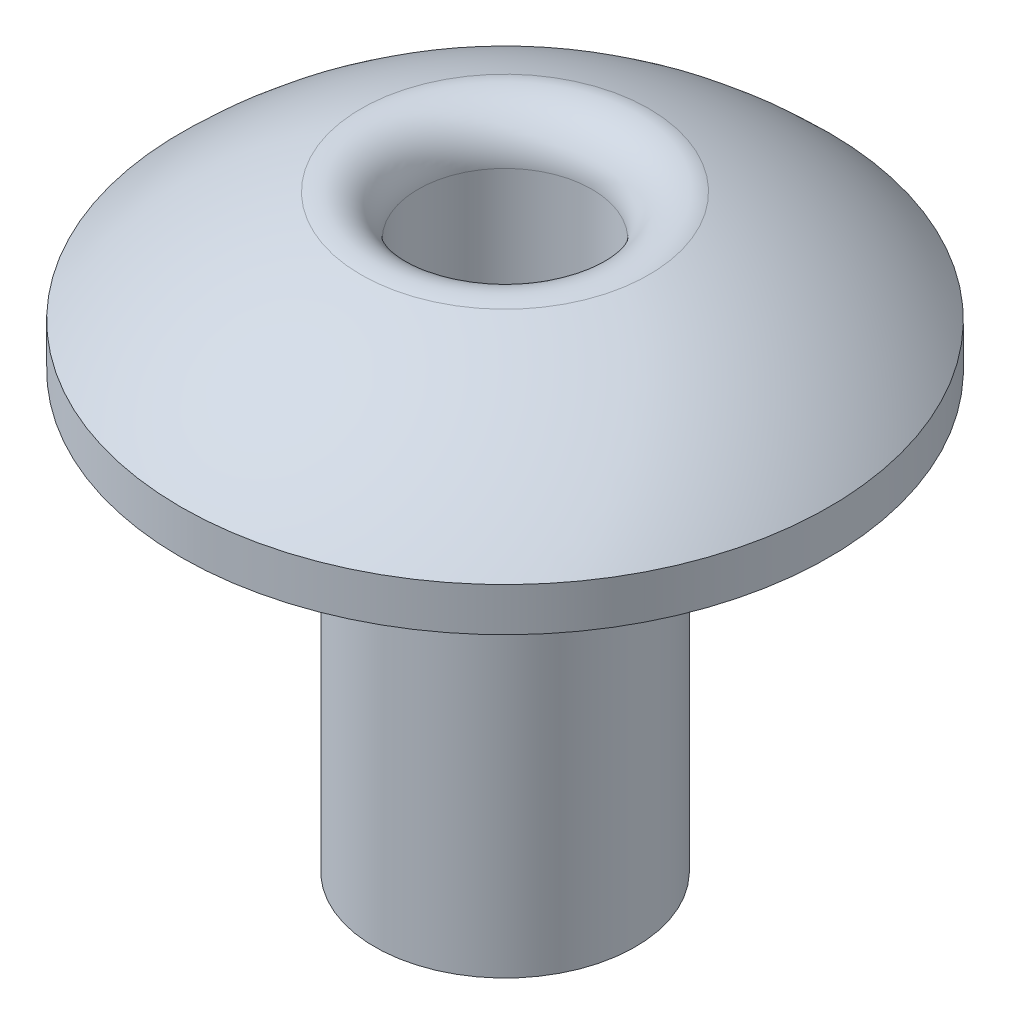
ISO-10303-21;
HEADER;
FILE_DESCRIPTION(('STEP AP214'),'2;1');
FILE_NAME('part.step','',(''),(''),'','','');
FILE_SCHEMA(('AUTOMOTIVE_DESIGN { 1 0 10303 214 1 1 1 1 }'));
ENDSEC;
DATA;
#1=APPLICATION_CONTEXT('core data for automotive mechanical design processes');
#2=APPLICATION_PROTOCOL_DEFINITION('international standard','automotive_design',2000,#1);
#3=PRODUCT_CONTEXT('',#1,'mechanical');
#4=PRODUCT('Part','Part','',(#3));
#5=PRODUCT_RELATED_PRODUCT_CATEGORY('part','',(#4));
#6=PRODUCT_DEFINITION_FORMATION('','',#4);
#7=PRODUCT_DEFINITION_CONTEXT('part definition',#1,'design');
#8=PRODUCT_DEFINITION('design','',#6,#7);
#9=PRODUCT_DEFINITION_SHAPE('','',#8);
#10=(LENGTH_UNIT() NAMED_UNIT(*) SI_UNIT(.MILLI.,.METRE.));
#11=(NAMED_UNIT(*) PLANE_ANGLE_UNIT() SI_UNIT($,.RADIAN.));
#12=(NAMED_UNIT(*) SI_UNIT($,.STERADIAN.) SOLID_ANGLE_UNIT());
#13=UNCERTAINTY_MEASURE_WITH_UNIT(LENGTH_MEASURE(1.E-05),#10,'distance_accuracy_value','');
#14=(GEOMETRIC_REPRESENTATION_CONTEXT(3) GLOBAL_UNCERTAINTY_ASSIGNED_CONTEXT((#13)) GLOBAL_UNIT_ASSIGNED_CONTEXT((#10,
#11,#12)) REPRESENTATION_CONTEXT('',''));
#15=CARTESIAN_POINT('',(0.,0.,0.));
#16=DIRECTION('',(0.,0.,1.));
#17=DIRECTION('',(1.,0.,0.));
#18=AXIS2_PLACEMENT_3D('',#15,#16,#17);
#19=CARTESIAN_POINT('',(0.,-3.73072489628794,0.));
#20=DIRECTION('',(0.,-1.,0.));
#21=DIRECTION('',(0.,0.,1.));
#22=AXIS2_PLACEMENT_3D('',#19,#20,#21);
#23=SPHERICAL_SURFACE('',#22,5.27604174581337);
#24=CARTESIAN_POINT('',(0.,1.27835241179299,0.));
#25=DIRECTION('',(0.,-1.,0.));
#26=DIRECTION('',(0.,0.,-1.));
#27=AXIS2_PLACEMENT_3D('',#24,#25,#26);
#28=CIRCLE('',#27,1.65703380328646);
#29=CARTESIAN_POINT('',(0.,1.27835241179299,1.65703380328647));
#30=VERTEX_POINT('',#29);
#31=EDGE_CURVE('E37',#30,#30,#28,.T.);
#32=CARTESIAN_POINT('',(0.,0.,0.));
#33=DIRECTION('',(0.,-1.,0.));
#34=DIRECTION('',(0.,0.,-1.));
#35=AXIS2_PLACEMENT_3D('',#32,#33,#34);
#36=CIRCLE('',#35,3.73072489628794);
#37=CARTESIAN_POINT('',(0.,0.,3.73072489628794));
#38=VERTEX_POINT('',#37);
#39=EDGE_CURVE('E50',#38,#38,#36,.T.);
#40=CARTESIAN_POINT('',(0.,1.27835241179299,1.65703380328647));
#41=CARTESIAN_POINT('',(0.,1.27031022298846,1.68134472575484));
#42=CARTESIAN_POINT('',(0.,1.26209102292589,1.70559709142554));
#43=CARTESIAN_POINT('',(0.,1.24530040158898,1.75397958827009));
#44=CARTESIAN_POINT('',(0.,1.23672898031464,1.77810971944394));
#45=CARTESIAN_POINT('',(0.,1.21923571785851,1.82624262639329));
#46=CARTESIAN_POINT('',(0.,1.21031387667673,1.85024540216879));
#47=CARTESIAN_POINT('',(0.,1.19212167000409,1.89811851136175));
#48=CARTESIAN_POINT('',(0.,1.18285130451323,1.92198884477921));
#49=CARTESIAN_POINT('',(0.,1.16396401334464,1.96959200851284));
#50=CARTESIAN_POINT('',(0.,1.15434708766691,1.99332483882901));
#51=CARTESIAN_POINT('',(0.,1.13476871515169,2.04064796526506));
#52=CARTESIAN_POINT('',(0.,1.1248072683142,2.06423826138493));
#53=CARTESIAN_POINT('',(0.,1.10454196515783,2.11127131841607));
#54=CARTESIAN_POINT('',(0.,1.09423810883896,2.13471407932734));
#55=CARTESIAN_POINT('',(0.,1.07329017108982,2.18144709624126));
#56=CARTESIAN_POINT('',(0.,1.06264608965957,2.2047373522439));
#57=CARTESIAN_POINT('',(0.,1.04101995815549,2.25116042196094));
#58=CARTESIAN_POINT('',(0.,1.03003790808167,2.27429323567534));
#59=CARTESIAN_POINT('',(0.,1.00773816741277,2.32039651681556));
#60=CARTESIAN_POINT('',(0.,0.996420476817683,2.34336698424139));
#61=CARTESIAN_POINT('',(0.,0.973451854380091,2.38914070321976));
#62=CARTESIAN_POINT('',(0.,0.961800922537583,2.41194395477231));
#63=CARTESIAN_POINT('',(0.,0.938168287524425,2.45737840786826));
#64=CARTESIAN_POINT('',(0.,0.926186584353775,2.48000960941165));
#65=CARTESIAN_POINT('',(0.,0.901894946724764,2.52509516482681));
#66=CARTESIAN_POINT('',(0.,0.889585012266403,2.54754951869857));
#67=CARTESIAN_POINT('',(0.,0.864639521685266,2.59227661859851));
#68=CARTESIAN_POINT('',(0.,0.852003965562491,2.61454936462669));
#69=CARTESIAN_POINT('',(0.,0.826409910305413,2.65890852716714));
#70=CARTESIAN_POINT('',(0.,0.813451411171111,2.68099494367941));
#71=CARTESIAN_POINT('',(0.,0.787214217005615,2.72497676501636));
#72=CARTESIAN_POINT('',(0.,0.773935521974422,2.74687216984102));
#73=CARTESIAN_POINT('',(0.,0.747060751009155,2.79046732612423));
#74=CARTESIAN_POINT('',(0.,0.733464675075082,2.81216707758277));
#75=CARTESIAN_POINT('',(0.,0.705958024580684,2.8553663269324));
#76=CARTESIAN_POINT('',(0.,0.69204745002036,2.87686582482349));
#77=CARTESIAN_POINT('',(0.,0.663914751221679,2.91966000928932));
#78=CARTESIAN_POINT('',(0.,0.649692626983322,2.94095469586405));
#79=CARTESIAN_POINT('',(0.,0.620939843823235,2.98333474336688));
#80=CARTESIAN_POINT('',(0.,0.606409184901505,3.00442010429497));
#81=CARTESIAN_POINT('',(0.,0.577042412776598,3.04637703054983));
#82=CARTESIAN_POINT('',(0.,0.562206299573421,3.06724859587661));
#83=CARTESIAN_POINT('',(0.,0.53223176404183,3.10877350629744));
#84=CARTESIAN_POINT('',(0.,0.517093341713415,3.1294268513915));
#85=CARTESIAN_POINT('',(0.,0.486517397174951,3.17051094297659));
#86=CARTESIAN_POINT('',(0.,0.471079874964902,3.19094168946764));
#87=CARTESIAN_POINT('',(0.,0.439909003314333,3.23157625266621));
#88=CARTESIAN_POINT('',(0.,0.424175653873815,3.25178006937374));
#89=CARTESIAN_POINT('',(0.,0.392416463125353,3.29195648993092));
#90=CARTESIAN_POINT('',(0.,0.37639062181741,3.31192909378057));
#91=CARTESIAN_POINT('',(0.,0.344049844709074,3.35163885456865));
#92=CARTESIAN_POINT('',(0.,0.327734908908682,3.37137601150708));
#93=CARTESIAN_POINT('',(0.,0.294819401455526,3.41061069431217));
#94=CARTESIAN_POINT('',(0.,0.278218829802762,3.43010822017882));
#95=CARTESIAN_POINT('',(0.,0.244735569916131,3.46885950755603));
#96=CARTESIAN_POINT('',(0.,0.227852881682264,3.48811326906658));
#97=CARTESIAN_POINT('',(0.,0.193808967419256,3.5263729458398));
#98=CARTESIAN_POINT('',(0.,0.176647741390116,3.54537886110246));
#99=CARTESIAN_POINT('',(0.,0.142050390461235,3.58313881708926));
#100=CARTESIAN_POINT('',(0.,0.124614265561494,3.60189285781339));
#101=CARTESIAN_POINT('',(0.,0.0894708100222417,3.63914508587446));
#102=CARTESIAN_POINT('',(0.,0.0717634793827303,3.6576432732114));
#103=CARTESIAN_POINT('',(0.,0.036081378180065,3.69437988464408));
#104=CARTESIAN_POINT('',(0.,0.0181066076169111,3.71261830873981));
#105=CARTESIAN_POINT('',(0.,0.,3.73072489628794));
#106=B_SPLINE_CURVE_WITH_KNOTS('',3,(#40,#41,#42,#43,#44,#45,#46,#47,#48,#49,#50,#51,#52,#53,
#54,#55,#56,#57,#58,#59,#60,#61,#62,#63,#64,#65,#66,#67,#68,#69,#70,#71,#72,#73,#74,#75,#76,#77,
#78,#79,#80,#81,#82,#83,#84,#85,#86,#87,#88,#89,#90,#91,#92,#93,#94,#95,#96,#97,#98,#99,#100,
#101,#102,#103,#104,#105),.UNSPECIFIED.,.F.,.F.,(4,2,2,2,2,2,2,2,2,2,2,2,2,2,2,2,2,2,2,2,2,2,2,
2,2,2,2,2,2,2,2,2,4),(0.,0.0768191084447271,0.153638216889454,0.230457325334182,
0.307276433778909,0.384095542223637,0.460914650668364,0.537733759113091,0.614552867557818,
0.691371976002545,0.768191084447272,0.845010192892,0.921829301336727,0.998648409781454,
1.07546751822618,1.15228662667091,1.22910573511564,1.30592484356036,1.38274395200509,
1.45956306044982,1.53638216889454,1.61320127733927,1.690020385784,1.76683949422873,
1.84365860267345,1.92047771111818,1.99729681956291,2.07411592800764,2.15093503645236,
2.22775414489709,2.30457325334182,2.38139236178654,2.45821147023127),.UNSPECIFIED.);
#107=EDGE_CURVE('BSEAM30',#30,#38,#106,.T.);
#108=ORIENTED_EDGE('',*,*,#31,.T.);
#109=ORIENTED_EDGE('',*,*,#39,.F.);
#110=ORIENTED_EDGE('',*,*,#107,.T.);
#111=ORIENTED_EDGE('',*,*,#107,.F.);
#112=EDGE_LOOP('',(#108,#110,#109,#111));
#113=FACE_BOUND('',#112,.T.);
#114=ADVANCED_FACE('F30',(#113),#23,.T.);
#115=CARTESIAN_POINT('',(0.,-0.500000000002922,3.73072489628794));
#116=DIRECTION('',(0.,1.,0.));
#117=DIRECTION('',(0.,0.,1.));
#118=AXIS2_PLACEMENT_3D('',#115,#116,#117);
#119=PLANE('',#118);
#120=CARTESIAN_POINT('',(0.,-0.500000000002922,0.));
#121=DIRECTION('',(0.,-1.,0.));
#122=DIRECTION('',(0.,0.,-1.));
#123=AXIS2_PLACEMENT_3D('',#120,#121,#122);
#124=CIRCLE('',#123,1.5);
#125=CARTESIAN_POINT('',(0.,-0.500000000002922,-1.5));
#126=VERTEX_POINT('',#125);
#127=EDGE_CURVE('E41',#126,#126,#124,.T.);
#128=ORIENTED_EDGE('',*,*,#127,.F.);
#129=EDGE_LOOP('',(#128));
#130=FACE_BOUND('',#129,.T.);
#131=CARTESIAN_POINT('',(0.,-0.5,0.));
#132=DIRECTION('',(0.,-1.,0.));
#133=DIRECTION('',(0.,0.,-1.));
#134=AXIS2_PLACEMENT_3D('',#131,#132,#133);
#135=CIRCLE('',#134,3.73072489628794);
#136=CARTESIAN_POINT('',(0.,-0.5,-3.73072489628794));
#137=VERTEX_POINT('',#136);
#138=EDGE_CURVE('E45',#137,#137,#135,.T.);
#139=ORIENTED_EDGE('',*,*,#138,.T.);
#140=EDGE_LOOP('',(#139));
#141=FACE_BOUND('',#140,.T.);
#142=ADVANCED_FACE('F75',(#130,#141),#119,.F.);
#143=CARTESIAN_POINT('',(0.,-0.500000000005845,0.));
#144=DIRECTION('',(0.,-1.,0.));
#145=DIRECTION('',(0.,0.,-1.));
#146=AXIS2_PLACEMENT_3D('',#143,#144,#145);
#147=CYLINDRICAL_SURFACE('',#146,3.73072489628794);
#148=ORIENTED_EDGE('',*,*,#138,.F.);
#149=EDGE_LOOP('',(#148));
#150=FACE_BOUND('',#149,.T.);
#151=ORIENTED_EDGE('',*,*,#39,.T.);
#152=EDGE_LOOP('',(#151));
#153=FACE_BOUND('',#152,.T.);
#154=ADVANCED_FACE('F71',(#150,#153),#147,.T.);
#155=CARTESIAN_POINT('',(0.,-5.50000000000292,0.));
#156=DIRECTION('',(0.,1.,0.));
#157=DIRECTION('',(0.,0.,1.));
#158=AXIS2_PLACEMENT_3D('',#155,#156,#157);
#159=CYLINDRICAL_SURFACE('',#158,1.5);
#160=CARTESIAN_POINT('',(0.,-5.50000000000292,0.));
#161=DIRECTION('',(0.,-1.,0.));
#162=DIRECTION('',(0.,0.,-1.));
#163=AXIS2_PLACEMENT_3D('',#160,#161,#162);
#164=CIRCLE('',#163,1.5);
#165=CARTESIAN_POINT('',(0.,-5.50000000000292,-1.5));
#166=VERTEX_POINT('',#165);
#167=EDGE_CURVE('E52',#166,#166,#164,.T.);
#168=ORIENTED_EDGE('',*,*,#167,.F.);
#169=EDGE_LOOP('',(#168));
#170=FACE_BOUND('',#169,.T.);
#171=ORIENTED_EDGE('',*,*,#127,.T.);
#172=EDGE_LOOP('',(#171));
#173=FACE_BOUND('',#172,.T.);
#174=ADVANCED_FACE('F65',(#170,#173),#159,.T.);
#175=CARTESIAN_POINT('',(0.,-5.50000000000292,0.));
#176=DIRECTION('',(0.,-1.,0.));
#177=DIRECTION('',(0.,0.,-1.));
#178=AXIS2_PLACEMENT_3D('',#175,#176,#177);
#179=PLANE('',#178);
#180=CARTESIAN_POINT('',(0.,-5.50000000000292,0.));
#181=DIRECTION('',(0.,-1.,0.));
#182=DIRECTION('',(0.,0.,-1.));
#183=AXIS2_PLACEMENT_3D('',#180,#181,#182);
#184=CIRCLE('',#183,1.);
#185=CARTESIAN_POINT('',(0.,-5.50000000000292,-1.));
#186=VERTEX_POINT('',#185);
#187=EDGE_CURVE('E56',#186,#186,#184,.T.);
#188=ORIENTED_EDGE('',*,*,#187,.F.);
#189=EDGE_LOOP('',(#188));
#190=FACE_BOUND('',#189,.T.);
#191=ORIENTED_EDGE('',*,*,#167,.T.);
#192=EDGE_LOOP('',(#191));
#193=FACE_BOUND('',#192,.T.);
#194=ADVANCED_FACE('F62',(#190,#193),#179,.T.);
#195=CARTESIAN_POINT('',(0.,1.54531684952542,0.));
#196=DIRECTION('',(0.,-1.,0.));
#197=DIRECTION('',(0.,0.,-1.));
#198=AXIS2_PLACEMENT_3D('',#195,#196,#197);
#199=CYLINDRICAL_SURFACE('',#198,1.);
#200=CARTESIAN_POINT('',(0.,0.80365210146511,0.));
#201=DIRECTION('',(0.,-1.,0.));
#202=DIRECTION('',(0.,0.,-1.));
#203=AXIS2_PLACEMENT_3D('',#200,#201,#202);
#204=CIRCLE('',#203,1.);
#205=CARTESIAN_POINT('',(0.,0.80365210146511,-1.));
#206=VERTEX_POINT('',#205);
#207=EDGE_CURVE('E10',#206,#206,#204,.F.);
#208=CARTESIAN_POINT('',(0.,0.80365210146511,-1.));
#209=CARTESIAN_POINT('',(0.,0.737989058741484,-1.));
#210=CARTESIAN_POINT('',(0.,0.672326016017859,-1.));
#211=CARTESIAN_POINT('',(0.,0.540999930570608,-1.));
#212=CARTESIAN_POINT('',(0.,0.475336887846983,-1.));
#213=CARTESIAN_POINT('',(0.,0.344010802399732,-1.));
#214=CARTESIAN_POINT('',(0.,0.278347759676107,-1.));
#215=CARTESIAN_POINT('',(0.,0.147021674228857,-1.));
#216=CARTESIAN_POINT('',(0.,0.0813586315052311,-1.));
#217=CARTESIAN_POINT('',(0.,-0.0499674539420196,-1.));
#218=CARTESIAN_POINT('',(0.,-0.115630496665645,-1.));
#219=CARTESIAN_POINT('',(0.,-0.246956582112896,-1.));
#220=CARTESIAN_POINT('',(0.,-0.312619624836521,-1.));
#221=CARTESIAN_POINT('',(0.,-0.443945710283771,-1.));
#222=CARTESIAN_POINT('',(0.,-0.509608753007397,-1.));
#223=CARTESIAN_POINT('',(0.,-0.640934838454647,-1.));
#224=CARTESIAN_POINT('',(0.,-0.706597881178273,-1.));
#225=CARTESIAN_POINT('',(0.,-0.837923966625523,-1.));
#226=CARTESIAN_POINT('',(0.,-0.903587009349149,-1.));
#227=CARTESIAN_POINT('',(0.,-1.0349130947964,-1.));
#228=CARTESIAN_POINT('',(0.,-1.10057613752002,-1.));
#229=CARTESIAN_POINT('',(0.,-1.23190222296728,-1.));
#230=CARTESIAN_POINT('',(0.,-1.2975652656909,-1.));
#231=CARTESIAN_POINT('',(0.,-1.42889135113815,-1.));
#232=CARTESIAN_POINT('',(0.,-1.49455439386178,-1.));
#233=CARTESIAN_POINT('',(0.,-1.62588047930903,-1.));
#234=CARTESIAN_POINT('',(0.,-1.69154352203265,-1.));
#235=CARTESIAN_POINT('',(0.,-1.8228696074799,-1.));
#236=CARTESIAN_POINT('',(0.,-1.88853265020353,-1.));
#237=CARTESIAN_POINT('',(0.,-2.01985873565078,-1.));
#238=CARTESIAN_POINT('',(0.,-2.0855217783744,-1.));
#239=CARTESIAN_POINT('',(0.,-2.21684786382166,-1.));
#240=CARTESIAN_POINT('',(0.,-2.28251090654528,-1.));
#241=CARTESIAN_POINT('',(0.,-2.41383699199253,-1.));
#242=CARTESIAN_POINT('',(0.,-2.47950003471616,-1.));
#243=CARTESIAN_POINT('',(0.,-2.61082612016341,-1.));
#244=CARTESIAN_POINT('',(0.,-2.67648916288703,-1.));
#245=CARTESIAN_POINT('',(0.,-2.80781524833428,-1.));
#246=CARTESIAN_POINT('',(0.,-2.87347829105791,-1.));
#247=CARTESIAN_POINT('',(0.,-3.00480437650516,-1.));
#248=CARTESIAN_POINT('',(0.,-3.07046741922878,-1.));
#249=CARTESIAN_POINT('',(0.,-3.20179350467604,-1.));
#250=CARTESIAN_POINT('',(0.,-3.26745654739966,-1.));
#251=CARTESIAN_POINT('',(0.,-3.39878263284691,-1.));
#252=CARTESIAN_POINT('',(0.,-3.46444567557054,-1.));
#253=CARTESIAN_POINT('',(0.,-3.59577176101779,-1.));
#254=CARTESIAN_POINT('',(0.,-3.66143480374141,-1.));
#255=CARTESIAN_POINT('',(0.,-3.79276088918866,-1.));
#256=CARTESIAN_POINT('',(0.,-3.85842393191229,-1.));
#257=CARTESIAN_POINT('',(0.,-3.98975001735954,-1.));
#258=CARTESIAN_POINT('',(0.,-4.05541306008316,-1.));
#259=CARTESIAN_POINT('',(0.,-4.18673914553042,-1.));
#260=CARTESIAN_POINT('',(0.,-4.25240218825404,-1.));
#261=CARTESIAN_POINT('',(0.,-4.38372827370129,-1.));
#262=CARTESIAN_POINT('',(0.,-4.44939131642492,-1.));
#263=CARTESIAN_POINT('',(0.,-4.58071740187217,-1.));
#264=CARTESIAN_POINT('',(0.,-4.64638044459579,-1.));
#265=CARTESIAN_POINT('',(0.,-4.77770653004304,-1.));
#266=CARTESIAN_POINT('',(0.,-4.84336957276667,-1.));
#267=CARTESIAN_POINT('',(0.,-4.97469565821392,-1.));
#268=CARTESIAN_POINT('',(0.,-5.04035870093754,-1.));
#269=CARTESIAN_POINT('',(0.,-5.17168478638479,-1.));
#270=CARTESIAN_POINT('',(0.,-5.23734782910842,-1.));
#271=CARTESIAN_POINT('',(0.,-5.36867391455567,-1.));
#272=CARTESIAN_POINT('',(0.,-5.4343369572793,-1.));
#273=CARTESIAN_POINT('',(0.,-5.50000000000292,-1.));
#274=B_SPLINE_CURVE_WITH_KNOTS('',3,(#208,#209,#210,#211,#212,#213,#214,#215,#216,#217,#218,
#219,#220,#221,#222,#223,#224,#225,#226,#227,#228,#229,#230,#231,#232,#233,#234,#235,#236,#237,
#238,#239,#240,#241,#242,#243,#244,#245,#246,#247,#248,#249,#250,#251,#252,#253,#254,#255,#256,
#257,#258,#259,#260,#261,#262,#263,#264,#265,#266,#267,#268,#269,#270,#271,#272,#273),
.UNSPECIFIED.,.F.,.F.,(4,2,2,2,2,2,2,2,2,2,2,2,2,2,2,2,2,2,2,2,2,2,2,2,2,2,2,2,2,2,2,2,4),(0.,
0.196989128170876,0.393978256341752,0.590967384512628,0.787956512683504,0.98494564085438,
1.18193476902526,1.37892389719613,1.57591302536701,1.77290215353788,1.96989128170876,
2.16688040987964,2.36386953805051,2.56085866622139,2.75784779439226,2.95483692256314,
3.15182605073402,3.34881517890489,3.54580430707577,3.74279343524664,3.93978256341752,
4.13677169158839,4.33376081975927,4.53074994793015,4.72773907610102,4.9247282042719,
5.12171733244278,5.31870646061365,5.51569558878453,5.7126847169554,5.90967384512628,
6.10666297329715,6.30365210146803),.UNSPECIFIED.);
#275=EDGE_CURVE('BSEAM60',#206,#186,#274,.T.);
#276=ORIENTED_EDGE('',*,*,#207,.T.);
#277=ORIENTED_EDGE('',*,*,#187,.T.);
#278=ORIENTED_EDGE('',*,*,#275,.T.);
#279=ORIENTED_EDGE('',*,*,#275,.F.);
#280=EDGE_LOOP('',(#276,#278,#277,#279));
#281=FACE_BOUND('',#280,.T.);
#282=ADVANCED_FACE('F60',(#281),#199,.F.);
#283=CARTESIAN_POINT('',(0.,0.803652101465109,0.));
#284=DIRECTION('',(0.,-1.,0.));
#285=DIRECTION('',(0.,0.,-1.));
#286=AXIS2_PLACEMENT_3D('',#283,#284,#285);
#287=TOROIDAL_SURFACE('',#286,1.5,0.5);
#288=ORIENTED_EDGE('',*,*,#207,.F.);
#289=EDGE_LOOP('',(#288));
#290=FACE_BOUND('',#289,.T.);
#291=ORIENTED_EDGE('',*,*,#31,.F.);
#292=EDGE_LOOP('',(#291));
#293=FACE_BOUND('',#292,.T.);
#294=ADVANCED_FACE('F32',(#290,#293),#287,.T.);
#295=CLOSED_SHELL('',(#114,#142,#154,#174,#194,#282,#294));
#296=MANIFOLD_SOLID_BREP('B2',#295);
#297=ADVANCED_BREP_SHAPE_REPRESENTATION('',(#18,#296),#14);
#298=SHAPE_DEFINITION_REPRESENTATION(#9,#297);
ENDSEC;
END-ISO-10303-21;
